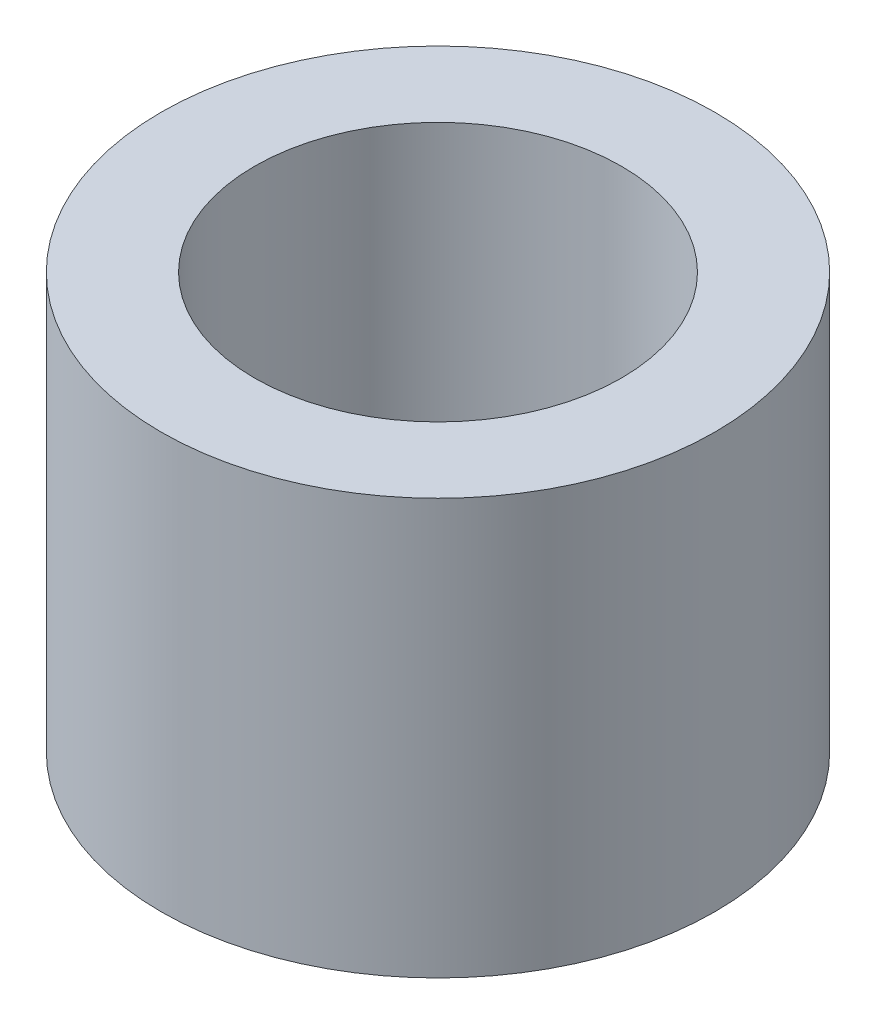
ISO-10303-21;
HEADER;
FILE_DESCRIPTION(('STEP AP214'),'2;1');
FILE_NAME('part.step','',(''),(''),'','','');
FILE_SCHEMA(('AUTOMOTIVE_DESIGN { 1 0 10303 214 1 1 1 1 }'));
ENDSEC;
DATA;
#1=APPLICATION_CONTEXT('core data for automotive mechanical design processes');
#2=APPLICATION_PROTOCOL_DEFINITION('international standard','automotive_design',2000,#1);
#3=PRODUCT_CONTEXT('',#1,'mechanical');
#4=PRODUCT('Part','Part','',(#3));
#5=PRODUCT_RELATED_PRODUCT_CATEGORY('part','',(#4));
#6=PRODUCT_DEFINITION_FORMATION('','',#4);
#7=PRODUCT_DEFINITION_CONTEXT('part definition',#1,'design');
#8=PRODUCT_DEFINITION('design','',#6,#7);
#9=PRODUCT_DEFINITION_SHAPE('','',#8);
#10=(LENGTH_UNIT() NAMED_UNIT(*) SI_UNIT(.MILLI.,.METRE.));
#11=(NAMED_UNIT(*) PLANE_ANGLE_UNIT() SI_UNIT($,.RADIAN.));
#12=(NAMED_UNIT(*) SI_UNIT($,.STERADIAN.) SOLID_ANGLE_UNIT());
#13=UNCERTAINTY_MEASURE_WITH_UNIT(LENGTH_MEASURE(1.E-05),#10,'distance_accuracy_value','');
#14=(GEOMETRIC_REPRESENTATION_CONTEXT(3) GLOBAL_UNCERTAINTY_ASSIGNED_CONTEXT((#13)) GLOBAL_UNIT_ASSIGNED_CONTEXT((#10,
#11,#12)) REPRESENTATION_CONTEXT('',''));
#15=CARTESIAN_POINT('',(0.,0.,0.));
#16=DIRECTION('',(0.,0.,1.));
#17=DIRECTION('',(1.,0.,0.));
#18=AXIS2_PLACEMENT_3D('',#15,#16,#17);
#19=CARTESIAN_POINT('',(0.,6.,0.));
#20=DIRECTION('',(0.,1.,0.));
#21=DIRECTION('',(0.,0.,1.));
#22=AXIS2_PLACEMENT_3D('',#19,#20,#21);
#23=PLANE('',#22);
#24=CARTESIAN_POINT('',(0.,6.,0.));
#25=DIRECTION('',(0.,1.,0.));
#26=DIRECTION('',(0.,0.,1.));
#27=AXIS2_PLACEMENT_3D('',#24,#25,#26);
#28=CIRCLE('',#27,4.);
#29=CARTESIAN_POINT('',(0.,6.,4.));
#30=VERTEX_POINT('',#29);
#31=EDGE_CURVE('E10',#30,#30,#28,.T.);
#32=ORIENTED_EDGE('',*,*,#31,.T.);
#33=EDGE_LOOP('',(#32));
#34=FACE_BOUND('',#33,.T.);
#35=CARTESIAN_POINT('',(0.,6.,0.));
#36=DIRECTION('',(0.,1.,0.));
#37=DIRECTION('',(0.,0.,1.));
#38=AXIS2_PLACEMENT_3D('',#35,#36,#37);
#39=CIRCLE('',#38,2.65);
#40=CARTESIAN_POINT('',(0.,6.,2.65));
#41=VERTEX_POINT('',#40);
#42=EDGE_CURVE('E42',#41,#41,#39,.T.);
#43=ORIENTED_EDGE('',*,*,#42,.F.);
#44=EDGE_LOOP('',(#43));
#45=FACE_BOUND('',#44,.T.);
#46=ADVANCED_FACE('F31',(#34,#45),#23,.T.);
#47=CARTESIAN_POINT('',(0.,0.,0.));
#48=DIRECTION('',(0.,1.,0.));
#49=DIRECTION('',(0.,0.,1.));
#50=AXIS2_PLACEMENT_3D('',#47,#48,#49);
#51=PLANE('',#50);
#52=CARTESIAN_POINT('',(0.,0.,0.));
#53=DIRECTION('',(0.,1.,0.));
#54=DIRECTION('',(0.,0.,1.));
#55=AXIS2_PLACEMENT_3D('',#52,#53,#54);
#56=CIRCLE('',#55,4.);
#57=CARTESIAN_POINT('',(0.,0.,4.));
#58=VERTEX_POINT('',#57);
#59=EDGE_CURVE('E35',#58,#58,#56,.T.);
#60=ORIENTED_EDGE('',*,*,#59,.F.);
#61=EDGE_LOOP('',(#60));
#62=FACE_BOUND('',#61,.T.);
#63=CARTESIAN_POINT('',(0.,0.,0.));
#64=DIRECTION('',(0.,1.,0.));
#65=DIRECTION('',(0.,0.,1.));
#66=AXIS2_PLACEMENT_3D('',#63,#64,#65);
#67=CIRCLE('',#66,2.65);
#68=CARTESIAN_POINT('',(0.,0.,2.65));
#69=VERTEX_POINT('',#68);
#70=EDGE_CURVE('E44',#69,#69,#67,.T.);
#71=ORIENTED_EDGE('',*,*,#70,.T.);
#72=EDGE_LOOP('',(#71));
#73=FACE_BOUND('',#72,.T.);
#74=ADVANCED_FACE('F54',(#62,#73),#51,.F.);
#75=CARTESIAN_POINT('',(0.,6.,0.));
#76=DIRECTION('',(0.,-1.,0.));
#77=DIRECTION('',(0.,0.,-1.));
#78=AXIS2_PLACEMENT_3D('',#75,#76,#77);
#79=CYLINDRICAL_SURFACE('',#78,4.);
#80=ORIENTED_EDGE('',*,*,#31,.F.);
#81=EDGE_LOOP('',(#80));
#82=FACE_BOUND('',#81,.T.);
#83=ORIENTED_EDGE('',*,*,#59,.T.);
#84=EDGE_LOOP('',(#83));
#85=FACE_BOUND('',#84,.T.);
#86=ADVANCED_FACE('F33',(#82,#85),#79,.T.);
#87=CARTESIAN_POINT('',(0.,6.,0.));
#88=DIRECTION('',(0.,-1.,0.));
#89=DIRECTION('',(0.,0.,-1.));
#90=AXIS2_PLACEMENT_3D('',#87,#88,#89);
#91=CYLINDRICAL_SURFACE('',#90,2.65);
#92=ORIENTED_EDGE('',*,*,#42,.T.);
#93=EDGE_LOOP('',(#92));
#94=FACE_BOUND('',#93,.T.);
#95=ORIENTED_EDGE('',*,*,#70,.F.);
#96=EDGE_LOOP('',(#95));
#97=FACE_BOUND('',#96,.T.);
#98=ADVANCED_FACE('F50',(#94,#97),#91,.F.);
#99=CLOSED_SHELL('',(#46,#74,#86,#98));
#100=MANIFOLD_SOLID_BREP('B2',#99);
#101=ADVANCED_BREP_SHAPE_REPRESENTATION('',(#18,#100),#14);
#102=SHAPE_DEFINITION_REPRESENTATION(#9,#101);
ENDSEC;
END-ISO-10303-21;
